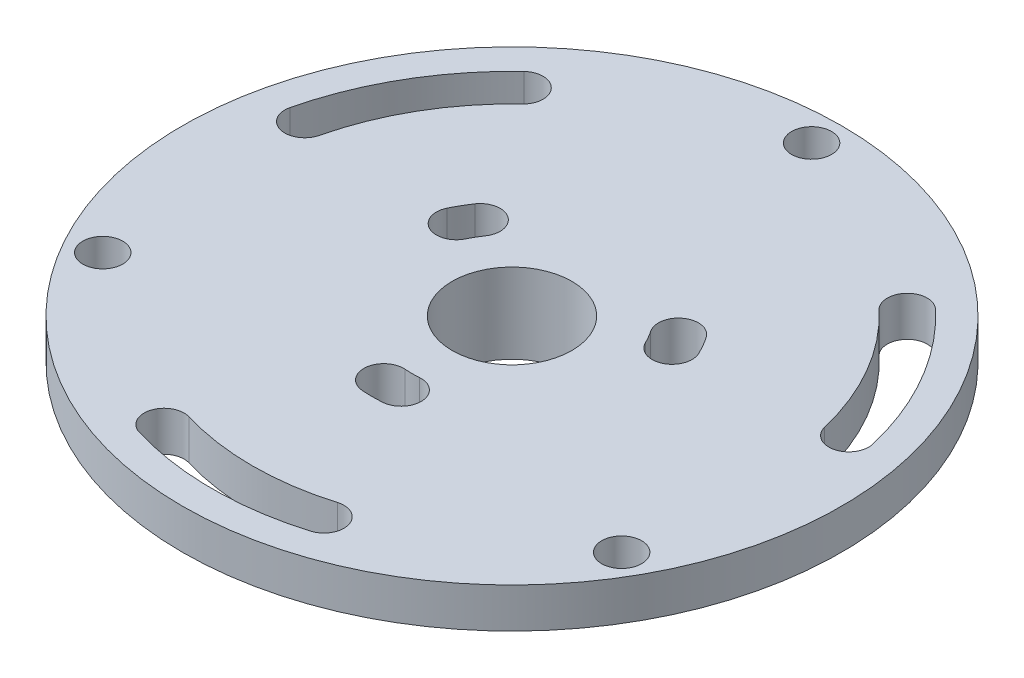
ISO-10303-21;
HEADER;
FILE_DESCRIPTION(('STEP AP214'),'2;1');
FILE_NAME('part.step','',(''),(''),'','','');
FILE_SCHEMA(('AUTOMOTIVE_DESIGN { 1 0 10303 214 1 1 1 1 }'));
ENDSEC;
DATA;
#1=APPLICATION_CONTEXT('core data for automotive mechanical design processes');
#2=APPLICATION_PROTOCOL_DEFINITION('international standard','automotive_design',2000,#1);
#3=PRODUCT_CONTEXT('',#1,'mechanical');
#4=PRODUCT('Part','Part','',(#3));
#5=PRODUCT_RELATED_PRODUCT_CATEGORY('part','',(#4));
#6=PRODUCT_DEFINITION_FORMATION('','',#4);
#7=PRODUCT_DEFINITION_CONTEXT('part definition',#1,'design');
#8=PRODUCT_DEFINITION('design','',#6,#7);
#9=PRODUCT_DEFINITION_SHAPE('','',#8);
#10=(LENGTH_UNIT() NAMED_UNIT(*) SI_UNIT(.MILLI.,.METRE.));
#11=(NAMED_UNIT(*) PLANE_ANGLE_UNIT() SI_UNIT($,.RADIAN.));
#12=(NAMED_UNIT(*) SI_UNIT($,.STERADIAN.) SOLID_ANGLE_UNIT());
#13=UNCERTAINTY_MEASURE_WITH_UNIT(LENGTH_MEASURE(1.E-05),#10,'distance_accuracy_value','');
#14=(GEOMETRIC_REPRESENTATION_CONTEXT(3) GLOBAL_UNCERTAINTY_ASSIGNED_CONTEXT((#13)) GLOBAL_UNIT_ASSIGNED_CONTEXT((#10,
#11,#12)) REPRESENTATION_CONTEXT('',''));
#15=CARTESIAN_POINT('',(0.,0.,0.));
#16=DIRECTION('',(0.,0.,1.));
#17=DIRECTION('',(1.,0.,0.));
#18=AXIS2_PLACEMENT_3D('',#15,#16,#17);
#19=CARTESIAN_POINT('',(0.,0.,0.));
#20=DIRECTION('',(0.,1.,0.));
#21=DIRECTION('',(0.,0.,1.));
#22=AXIS2_PLACEMENT_3D('',#19,#20,#21);
#23=PLANE('',#22);
#24=CARTESIAN_POINT('',(0.,0.,0.));
#25=DIRECTION('',(0.,-1.,0.));
#26=DIRECTION('',(0.,0.,1.));
#27=AXIS2_PLACEMENT_3D('',#24,#25,#26);
#28=CIRCLE('',#27,5.);
#29=CARTESIAN_POINT('',(-4.49987010334877,0.,-2.17971765441948));
#30=VERTEX_POINT('',#29);
#31=CARTESIAN_POINT('',(-4.13762591347903,0.,-2.80714299602047));
#32=VERTEX_POINT('',#31);
#33=EDGE_CURVE('E277',#30,#32,#28,.T.);
#34=ORIENTED_EDGE('',*,*,#33,.T.);
#35=CARTESIAN_POINT('',(-4.96515109617484,0.,-3.36857159522456));
#36=DIRECTION('',(0.,1.,0.));
#37=DIRECTION('',(0.,0.,1.));
#38=AXIS2_PLACEMENT_3D('',#35,#36,#37);
#39=CIRCLE('',#38,1.);
#40=CARTESIAN_POINT('',(-5.79267627887065,0.,-3.93000019442866));
#41=VERTEX_POINT('',#40);
#42=EDGE_CURVE('E269',#32,#41,#39,.T.);
#43=ORIENTED_EDGE('',*,*,#42,.T.);
#44=CARTESIAN_POINT('',(0.,0.,0.));
#45=DIRECTION('',(0.,1.,0.));
#46=DIRECTION('',(0.,0.,1.));
#47=AXIS2_PLACEMENT_3D('',#44,#45,#46);
#48=CIRCLE('',#47,7.);
#49=CARTESIAN_POINT('',(-6.29981814468828,0.,-3.05160471618727));
#50=VERTEX_POINT('',#49);
#51=EDGE_CURVE('E272',#41,#50,#48,.T.);
#52=ORIENTED_EDGE('',*,*,#51,.T.);
#53=CARTESIAN_POINT('',(-5.39984412401852,0.,-2.61566118530337));
#54=DIRECTION('',(0.,1.,0.));
#55=DIRECTION('',(0.,0.,1.));
#56=AXIS2_PLACEMENT_3D('',#53,#54,#55);
#57=CIRCLE('',#56,0.999999999999999);
#58=EDGE_CURVE('E49',#50,#30,#57,.T.);
#59=ORIENTED_EDGE('',*,*,#58,.T.);
#60=EDGE_LOOP('',(#34,#43,#52,#59));
#61=FACE_BOUND('',#60,.T.);
#62=CARTESIAN_POINT('',(0.,0.,0.));
#63=DIRECTION('',(0.,-1.,0.));
#64=DIRECTION('',(0.,0.,1.));
#65=AXIS2_PLACEMENT_3D('',#62,#63,#64);
#66=CIRCLE('',#65,13.);
#67=CARTESIAN_POINT('',(-12.6462331418066,0.,-3.01210679144539));
#68=VERTEX_POINT('',#67);
#69=CARTESIAN_POINT('',(-8.93167757120652,0.,-9.44590576726269));
#70=VERTEX_POINT('',#69);
#71=EDGE_CURVE('E247',#68,#70,#66,.T.);
#72=ORIENTED_EDGE('',*,*,#71,.T.);
#73=CARTESIAN_POINT('',(-9.61872969206856,0.,-10.172513903206));
#74=DIRECTION('',(0.,1.,0.));
#75=DIRECTION('',(0.,0.,1.));
#76=AXIS2_PLACEMENT_3D('',#73,#74,#75);
#77=CIRCLE('',#76,1.);
#78=CARTESIAN_POINT('',(-10.3057818129306,0.,-10.8991220391493));
#79=VERTEX_POINT('',#78);
#80=EDGE_CURVE('E239',#70,#79,#77,.T.);
#81=ORIENTED_EDGE('',*,*,#80,.T.);
#82=CARTESIAN_POINT('',(0.,0.,0.));
#83=DIRECTION('',(0.,1.,0.));
#84=DIRECTION('',(0.,0.,1.));
#85=AXIS2_PLACEMENT_3D('',#82,#83,#84);
#86=CIRCLE('',#85,15.);
#87=CARTESIAN_POINT('',(-14.5918074713154,0.,-3.47550783628315));
#88=VERTEX_POINT('',#87);
#89=EDGE_CURVE('E242',#79,#88,#86,.T.);
#90=ORIENTED_EDGE('',*,*,#89,.T.);
#91=CARTESIAN_POINT('',(-13.619020306561,0.,-3.24380731386427));
#92=DIRECTION('',(0.,1.,0.));
#93=DIRECTION('',(0.,0.,1.));
#94=AXIS2_PLACEMENT_3D('',#91,#92,#93);
#95=CIRCLE('',#94,1.);
#96=EDGE_CURVE('E57',#88,#68,#95,.T.);
#97=ORIENTED_EDGE('',*,*,#96,.T.);
#98=EDGE_LOOP('',(#72,#81,#90,#97));
#99=FACE_BOUND('',#98,.T.);
#100=CARTESIAN_POINT('',(0.,0.,0.));
#101=DIRECTION('',(0.,-1.,0.));
#102=DIRECTION('',(0.,0.,1.));
#103=AXIS2_PLACEMENT_3D('',#100,#101,#102);
#104=CIRCLE('',#103,5.);
#105=CARTESIAN_POINT('',(0.362244189869713,0.,4.98686065043988));
#106=VERTEX_POINT('',#105);
#107=CARTESIAN_POINT('',(-0.362244189869749,0.,4.98686065043988));
#108=VERTEX_POINT('',#107);
#109=EDGE_CURVE('E207',#106,#108,#104,.T.);
#110=ORIENTED_EDGE('',*,*,#109,.T.);
#111=CARTESIAN_POINT('',(-0.434693027843695,0.,5.98423278052785));
#112=DIRECTION('',(0.,1.,0.));
#113=DIRECTION('',(0.,0.,1.));
#114=AXIS2_PLACEMENT_3D('',#111,#112,#113);
#115=CIRCLE('',#114,1.);
#116=CARTESIAN_POINT('',(-0.507141865817648,0.,6.98160491061583));
#117=VERTEX_POINT('',#116);
#118=EDGE_CURVE('E199',#108,#117,#115,.T.);
#119=ORIENTED_EDGE('',*,*,#118,.T.);
#120=CARTESIAN_POINT('',(0.,0.,0.));
#121=DIRECTION('',(0.,1.,0.));
#122=DIRECTION('',(0.,0.,1.));
#123=AXIS2_PLACEMENT_3D('',#120,#121,#122);
#124=CIRCLE('',#123,7.);
#125=CARTESIAN_POINT('',(0.507141865817597,0.,6.98160491061583));
#126=VERTEX_POINT('',#125);
#127=EDGE_CURVE('E211',#117,#126,#124,.T.);
#128=ORIENTED_EDGE('',*,*,#127,.T.);
#129=CARTESIAN_POINT('',(0.434693027843655,0.,5.98423278052786));
#130=DIRECTION('',(0.,1.,0.));
#131=DIRECTION('',(0.,0.,1.));
#132=AXIS2_PLACEMENT_3D('',#129,#130,#131);
#133=CIRCLE('',#132,0.999999999999999);
#134=EDGE_CURVE('E215',#126,#106,#133,.T.);
#135=ORIENTED_EDGE('',*,*,#134,.T.);
#136=EDGE_LOOP('',(#110,#119,#128,#135));
#137=FACE_BOUND('',#136,.T.);
#138=CARTESIAN_POINT('',(0.,0.,0.));
#139=DIRECTION('',(0.,-1.,0.));
#140=DIRECTION('',(0.,0.,1.));
#141=AXIS2_PLACEMENT_3D('',#138,#139,#140);
#142=CIRCLE('',#141,13.);
#143=CARTESIAN_POINT('',(3.71455557060004,0.,12.4580125587079));
#144=VERTEX_POINT('',#143);
#145=CARTESIAN_POINT('',(-3.71455557060012,0.,12.4580125587079));
#146=VERTEX_POINT('',#145);
#147=EDGE_CURVE('E342',#144,#146,#142,.T.);
#148=ORIENTED_EDGE('',*,*,#147,.T.);
#149=CARTESIAN_POINT('',(-4.00029061449243,0.,13.41632121707));
#150=DIRECTION('',(0.,1.,0.));
#151=DIRECTION('',(0.,0.,1.));
#152=AXIS2_PLACEMENT_3D('',#149,#150,#151);
#153=CIRCLE('',#152,1.);
#154=CARTESIAN_POINT('',(-4.28602565838475,0.,14.3746298754322));
#155=VERTEX_POINT('',#154);
#156=EDGE_CURVE('E332',#146,#155,#153,.T.);
#157=ORIENTED_EDGE('',*,*,#156,.T.);
#158=CARTESIAN_POINT('',(0.,0.,0.));
#159=DIRECTION('',(0.,1.,0.));
#160=DIRECTION('',(0.,0.,1.));
#161=AXIS2_PLACEMENT_3D('',#158,#159,#160);
#162=CIRCLE('',#161,15.);
#163=CARTESIAN_POINT('',(4.28602565838466,0.,14.3746298754322));
#164=VERTEX_POINT('',#163);
#165=EDGE_CURVE('E335',#155,#164,#162,.T.);
#166=ORIENTED_EDGE('',*,*,#165,.T.);
#167=CARTESIAN_POINT('',(4.00029061449235,0.,13.4163212170701));
#168=DIRECTION('',(0.,1.,0.));
#169=DIRECTION('',(0.,0.,1.));
#170=AXIS2_PLACEMENT_3D('',#167,#168,#169);
#171=CIRCLE('',#170,1.);
#172=EDGE_CURVE('E339',#164,#144,#171,.T.);
#173=ORIENTED_EDGE('',*,*,#172,.T.);
#174=EDGE_LOOP('',(#148,#157,#166,#173));
#175=FACE_BOUND('',#174,.T.);
#176=CARTESIAN_POINT('',(0.,0.,0.));
#177=DIRECTION('',(0.,-1.,0.));
#178=DIRECTION('',(0.,0.,1.));
#179=AXIS2_PLACEMENT_3D('',#176,#177,#178);
#180=CIRCLE('',#179,5.);
#181=CARTESIAN_POINT('',(4.13762591347906,0.,-2.80714299602044));
#182=VERTEX_POINT('',#181);
#183=CARTESIAN_POINT('',(4.49987010334878,0.,-2.17971765441945));
#184=VERTEX_POINT('',#183);
#185=EDGE_CURVE('E308',#182,#184,#180,.T.);
#186=ORIENTED_EDGE('',*,*,#185,.T.);
#187=CARTESIAN_POINT('',(5.39984412401854,0.,-2.61566118530334));
#188=DIRECTION('',(0.,1.,0.));
#189=DIRECTION('',(0.,0.,1.));
#190=AXIS2_PLACEMENT_3D('',#187,#188,#189);
#191=CIRCLE('',#190,1.);
#192=CARTESIAN_POINT('',(6.2998181446883,0.,-3.05160471618722));
#193=VERTEX_POINT('',#192);
#194=EDGE_CURVE('E298',#184,#193,#191,.T.);
#195=ORIENTED_EDGE('',*,*,#194,.T.);
#196=CARTESIAN_POINT('',(0.,0.,0.));
#197=DIRECTION('',(0.,1.,0.));
#198=DIRECTION('',(0.,0.,1.));
#199=AXIS2_PLACEMENT_3D('',#196,#197,#198);
#200=CIRCLE('',#199,7.);
#201=CARTESIAN_POINT('',(5.79267627887068,0.,-3.93000019442862));
#202=VERTEX_POINT('',#201);
#203=EDGE_CURVE('E301',#193,#202,#200,.T.);
#204=ORIENTED_EDGE('',*,*,#203,.T.);
#205=CARTESIAN_POINT('',(4.96515109617487,0.,-3.36857159522453));
#206=DIRECTION('',(0.,1.,0.));
#207=DIRECTION('',(0.,0.,1.));
#208=AXIS2_PLACEMENT_3D('',#205,#206,#207);
#209=CIRCLE('',#208,0.999999999999999);
#210=EDGE_CURVE('E305',#202,#182,#209,.T.);
#211=ORIENTED_EDGE('',*,*,#210,.T.);
#212=EDGE_LOOP('',(#186,#195,#204,#211));
#213=FACE_BOUND('',#212,.T.);
#214=CARTESIAN_POINT('',(0.,0.,0.));
#215=DIRECTION('',(0.,-1.,0.));
#216=DIRECTION('',(0.,0.,1.));
#217=AXIS2_PLACEMENT_3D('',#214,#215,#216);
#218=CIRCLE('',#217,13.);
#219=CARTESIAN_POINT('',(8.93167757120658,0.,-9.44590576726263));
#220=VERTEX_POINT('',#219);
#221=CARTESIAN_POINT('',(12.6462331418067,0.,-3.01210679144531));
#222=VERTEX_POINT('',#221);
#223=EDGE_CURVE('E372',#220,#222,#218,.T.);
#224=ORIENTED_EDGE('',*,*,#223,.T.);
#225=CARTESIAN_POINT('',(13.619020306561,0.,-3.24380731386418));
#226=DIRECTION('',(0.,1.,0.));
#227=DIRECTION('',(0.,0.,1.));
#228=AXIS2_PLACEMENT_3D('',#225,#226,#227);
#229=CIRCLE('',#228,1.);
#230=CARTESIAN_POINT('',(14.5918074713154,0.,-3.47550783628305));
#231=VERTEX_POINT('',#230);
#232=EDGE_CURVE('E362',#222,#231,#229,.T.);
#233=ORIENTED_EDGE('',*,*,#232,.T.);
#234=CARTESIAN_POINT('',(0.,0.,0.));
#235=DIRECTION('',(0.,1.,0.));
#236=DIRECTION('',(0.,0.,1.));
#237=AXIS2_PLACEMENT_3D('',#234,#235,#236);
#238=CIRCLE('',#237,15.);
#239=CARTESIAN_POINT('',(10.3057818129307,0.,-10.8991220391492));
#240=VERTEX_POINT('',#239);
#241=EDGE_CURVE('E365',#231,#240,#238,.T.);
#242=ORIENTED_EDGE('',*,*,#241,.T.);
#243=CARTESIAN_POINT('',(9.61872969206862,0.,-10.1725139032059));
#244=DIRECTION('',(0.,1.,0.));
#245=DIRECTION('',(0.,0.,1.));
#246=AXIS2_PLACEMENT_3D('',#243,#244,#245);
#247=CIRCLE('',#246,1.);
#248=EDGE_CURVE('E369',#240,#220,#247,.T.);
#249=ORIENTED_EDGE('',*,*,#248,.T.);
#250=EDGE_LOOP('',(#224,#233,#242,#249));
#251=FACE_BOUND('',#250,.T.);
#252=CARTESIAN_POINT('',(-12.9903810567656,0.,7.50000000000056));
#253=DIRECTION('',(0.,1.,0.));
#254=DIRECTION('',(0.,0.,1.));
#255=AXIS2_PLACEMENT_3D('',#252,#253,#254);
#256=CIRCLE('',#255,1.00000000000122);
#257=CARTESIAN_POINT('',(-12.9903810567656,0.,8.50000000000178));
#258=VERTEX_POINT('',#257);
#259=EDGE_CURVE('E399',#258,#258,#256,.T.);
#260=ORIENTED_EDGE('',*,*,#259,.T.);
#261=EDGE_LOOP('',(#260));
#262=FACE_BOUND('',#261,.T.);
#263=CARTESIAN_POINT('',(12.9903810567675,0.,7.49999999999944));
#264=DIRECTION('',(0.,1.,0.));
#265=DIRECTION('',(0.,0.,1.));
#266=AXIS2_PLACEMENT_3D('',#263,#264,#265);
#267=CIRCLE('',#266,1.00000000000082);
#268=CARTESIAN_POINT('',(12.9903810567675,0.,8.50000000000027));
#269=VERTEX_POINT('',#268);
#270=EDGE_CURVE('E403',#269,#269,#267,.T.);
#271=ORIENTED_EDGE('',*,*,#270,.T.);
#272=EDGE_LOOP('',(#271));
#273=FACE_BOUND('',#272,.T.);
#274=CARTESIAN_POINT('',(0.,0.,-15.));
#275=DIRECTION('',(0.,1.,0.));
#276=DIRECTION('',(0.,0.,1.));
#277=AXIS2_PLACEMENT_3D('',#274,#275,#276);
#278=CIRCLE('',#277,1.);
#279=CARTESIAN_POINT('',(0.,0.,-14.));
#280=VERTEX_POINT('',#279);
#281=EDGE_CURVE('E414',#280,#280,#278,.T.);
#282=ORIENTED_EDGE('',*,*,#281,.T.);
#283=EDGE_LOOP('',(#282));
#284=FACE_BOUND('',#283,.T.);
#285=CARTESIAN_POINT('',(0.,0.,0.));
#286=DIRECTION('',(0.,1.,0.));
#287=DIRECTION('',(0.,0.,1.));
#288=AXIS2_PLACEMENT_3D('',#285,#286,#287);
#289=CIRCLE('',#288,16.5);
#290=CARTESIAN_POINT('',(0.,0.,16.5));
#291=VERTEX_POINT('',#290);
#292=EDGE_CURVE('E418',#291,#291,#289,.T.);
#293=ORIENTED_EDGE('',*,*,#292,.F.);
#294=EDGE_LOOP('',(#293));
#295=FACE_BOUND('',#294,.T.);
#296=CARTESIAN_POINT('',(0.,0.,0.));
#297=DIRECTION('',(0.,1.,0.));
#298=DIRECTION('',(0.,0.,1.));
#299=AXIS2_PLACEMENT_3D('',#296,#297,#298);
#300=CIRCLE('',#299,4.);
#301=CARTESIAN_POINT('',(0.,0.,4.));
#302=VERTEX_POINT('',#301);
#303=EDGE_CURVE('E11',#302,#302,#300,.F.);
#304=ORIENTED_EDGE('',*,*,#303,.F.);
#305=EDGE_LOOP('',(#304));
#306=FACE_BOUND('',#305,.T.);
#307=ADVANCED_FACE('F34',(#61,#99,#137,#175,#213,#251,#262,#273,#284,#295,#306),#23,.F.);
#308=CARTESIAN_POINT('',(0.,2.,0.));
#309=DIRECTION('',(0.,1.,0.));
#310=DIRECTION('',(0.,0.,1.));
#311=AXIS2_PLACEMENT_3D('',#308,#309,#310);
#312=PLANE('',#311);
#313=CARTESIAN_POINT('',(-4.96515109617484,2.,-3.36857159522456));
#314=DIRECTION('',(0.,1.,0.));
#315=DIRECTION('',(0.,0.,1.));
#316=AXIS2_PLACEMENT_3D('',#313,#314,#315);
#317=CIRCLE('',#316,1.);
#318=CARTESIAN_POINT('',(-4.13762591347903,2.,-2.80714299602047));
#319=VERTEX_POINT('',#318);
#320=CARTESIAN_POINT('',(-5.79267627887065,2.,-3.93000019442866));
#321=VERTEX_POINT('',#320);
#322=EDGE_CURVE('E281',#319,#321,#317,.T.);
#323=ORIENTED_EDGE('',*,*,#322,.F.);
#324=CARTESIAN_POINT('',(0.,2.,0.));
#325=DIRECTION('',(0.,-1.,0.));
#326=DIRECTION('',(0.,0.,1.));
#327=AXIS2_PLACEMENT_3D('',#324,#325,#326);
#328=CIRCLE('',#327,5.);
#329=CARTESIAN_POINT('',(-4.49987010334877,2.,-2.17971765441948));
#330=VERTEX_POINT('',#329);
#331=EDGE_CURVE('E273',#330,#319,#328,.T.);
#332=ORIENTED_EDGE('',*,*,#331,.F.);
#333=CARTESIAN_POINT('',(-5.39984412401852,2.,-2.61566118530337));
#334=DIRECTION('',(0.,1.,0.));
#335=DIRECTION('',(0.,0.,1.));
#336=AXIS2_PLACEMENT_3D('',#333,#334,#335);
#337=CIRCLE('',#336,0.999999999999999);
#338=CARTESIAN_POINT('',(-6.29981814468828,2.,-3.05160471618727));
#339=VERTEX_POINT('',#338);
#340=EDGE_CURVE('E286',#339,#330,#337,.T.);
#341=ORIENTED_EDGE('',*,*,#340,.F.);
#342=CARTESIAN_POINT('',(0.,2.,0.));
#343=DIRECTION('',(0.,1.,0.));
#344=DIRECTION('',(0.,0.,1.));
#345=AXIS2_PLACEMENT_3D('',#342,#343,#344);
#346=CIRCLE('',#345,7.);
#347=EDGE_CURVE('E283',#321,#339,#346,.T.);
#348=ORIENTED_EDGE('',*,*,#347,.F.);
#349=EDGE_LOOP('',(#323,#332,#341,#348));
#350=FACE_BOUND('',#349,.T.);
#351=CARTESIAN_POINT('',(-9.61872969206856,2.,-10.172513903206));
#352=DIRECTION('',(0.,1.,0.));
#353=DIRECTION('',(0.,0.,1.));
#354=AXIS2_PLACEMENT_3D('',#351,#352,#353);
#355=CIRCLE('',#354,1.);
#356=CARTESIAN_POINT('',(-8.93167757120652,2.,-9.44590576726269));
#357=VERTEX_POINT('',#356);
#358=CARTESIAN_POINT('',(-10.3057818129306,2.,-10.8991220391493));
#359=VERTEX_POINT('',#358);
#360=EDGE_CURVE('E251',#357,#359,#355,.T.);
#361=ORIENTED_EDGE('',*,*,#360,.F.);
#362=CARTESIAN_POINT('',(0.,2.,0.));
#363=DIRECTION('',(0.,-1.,0.));
#364=DIRECTION('',(0.,0.,1.));
#365=AXIS2_PLACEMENT_3D('',#362,#363,#364);
#366=CIRCLE('',#365,13.);
#367=CARTESIAN_POINT('',(-12.6462331418066,2.,-3.01210679144539));
#368=VERTEX_POINT('',#367);
#369=EDGE_CURVE('E243',#368,#357,#366,.T.);
#370=ORIENTED_EDGE('',*,*,#369,.F.);
#371=CARTESIAN_POINT('',(-13.619020306561,2.,-3.24380731386427));
#372=DIRECTION('',(0.,1.,0.));
#373=DIRECTION('',(0.,0.,1.));
#374=AXIS2_PLACEMENT_3D('',#371,#372,#373);
#375=CIRCLE('',#374,1.);
#376=CARTESIAN_POINT('',(-14.5918074713154,2.,-3.47550783628315));
#377=VERTEX_POINT('',#376);
#378=EDGE_CURVE('E257',#377,#368,#375,.T.);
#379=ORIENTED_EDGE('',*,*,#378,.F.);
#380=CARTESIAN_POINT('',(0.,2.,0.));
#381=DIRECTION('',(0.,1.,0.));
#382=DIRECTION('',(0.,0.,1.));
#383=AXIS2_PLACEMENT_3D('',#380,#381,#382);
#384=CIRCLE('',#383,15.);
#385=EDGE_CURVE('E253',#359,#377,#384,.T.);
#386=ORIENTED_EDGE('',*,*,#385,.F.);
#387=EDGE_LOOP('',(#361,#370,#379,#386));
#388=FACE_BOUND('',#387,.T.);
#389=CARTESIAN_POINT('',(-0.434693027843695,2.,5.98423278052785));
#390=DIRECTION('',(0.,1.,0.));
#391=DIRECTION('',(0.,0.,1.));
#392=AXIS2_PLACEMENT_3D('',#389,#390,#391);
#393=CIRCLE('',#392,1.);
#394=CARTESIAN_POINT('',(-0.362244189869749,2.,4.98686065043988));
#395=VERTEX_POINT('',#394);
#396=CARTESIAN_POINT('',(-0.507141865817648,2.,6.98160491061583));
#397=VERTEX_POINT('',#396);
#398=EDGE_CURVE('E202',#395,#397,#393,.T.);
#399=ORIENTED_EDGE('',*,*,#398,.F.);
#400=CARTESIAN_POINT('',(0.,2.,0.));
#401=DIRECTION('',(0.,-1.,0.));
#402=DIRECTION('',(0.,0.,1.));
#403=AXIS2_PLACEMENT_3D('',#400,#401,#402);
#404=CIRCLE('',#403,5.);
#405=CARTESIAN_POINT('',(0.362244189869713,2.,4.98686065043988));
#406=VERTEX_POINT('',#405);
#407=EDGE_CURVE('E219',#406,#395,#404,.T.);
#408=ORIENTED_EDGE('',*,*,#407,.F.);
#409=CARTESIAN_POINT('',(0.434693027843655,2.,5.98423278052786));
#410=DIRECTION('',(0.,1.,0.));
#411=DIRECTION('',(0.,0.,1.));
#412=AXIS2_PLACEMENT_3D('',#409,#410,#411);
#413=CIRCLE('',#412,0.999999999999999);
#414=CARTESIAN_POINT('',(0.507141865817597,2.,6.98160491061583));
#415=VERTEX_POINT('',#414);
#416=EDGE_CURVE('E222',#415,#406,#413,.T.);
#417=ORIENTED_EDGE('',*,*,#416,.F.);
#418=CARTESIAN_POINT('',(0.,2.,0.));
#419=DIRECTION('',(0.,1.,0.));
#420=DIRECTION('',(0.,0.,1.));
#421=AXIS2_PLACEMENT_3D('',#418,#419,#420);
#422=CIRCLE('',#421,7.);
#423=EDGE_CURVE('E228',#397,#415,#422,.T.);
#424=ORIENTED_EDGE('',*,*,#423,.F.);
#425=EDGE_LOOP('',(#399,#408,#417,#424));
#426=FACE_BOUND('',#425,.T.);
#427=CARTESIAN_POINT('',(-4.00029061449243,2.,13.41632121707));
#428=DIRECTION('',(0.,1.,0.));
#429=DIRECTION('',(0.,0.,1.));
#430=AXIS2_PLACEMENT_3D('',#427,#428,#429);
#431=CIRCLE('',#430,1.);
#432=CARTESIAN_POINT('',(-3.71455557060012,2.,12.4580125587079));
#433=VERTEX_POINT('',#432);
#434=CARTESIAN_POINT('',(-4.28602565838475,2.,14.3746298754322));
#435=VERTEX_POINT('',#434);
#436=EDGE_CURVE('E235',#433,#435,#431,.T.);
#437=ORIENTED_EDGE('',*,*,#436,.F.);
#438=CARTESIAN_POINT('',(0.,2.,0.));
#439=DIRECTION('',(0.,-1.,0.));
#440=DIRECTION('',(0.,0.,1.));
#441=AXIS2_PLACEMENT_3D('',#438,#439,#440);
#442=CIRCLE('',#441,13.);
#443=CARTESIAN_POINT('',(3.71455557060004,2.,12.4580125587079));
#444=VERTEX_POINT('',#443);
#445=EDGE_CURVE('E336',#444,#433,#442,.T.);
#446=ORIENTED_EDGE('',*,*,#445,.F.);
#447=CARTESIAN_POINT('',(4.00029061449235,2.,13.4163212170701));
#448=DIRECTION('',(0.,1.,0.));
#449=DIRECTION('',(0.,0.,1.));
#450=AXIS2_PLACEMENT_3D('',#447,#448,#449);
#451=CIRCLE('',#450,1.);
#452=CARTESIAN_POINT('',(4.28602565838466,2.,14.3746298754322));
#453=VERTEX_POINT('',#452);
#454=EDGE_CURVE('E350',#453,#444,#451,.T.);
#455=ORIENTED_EDGE('',*,*,#454,.F.);
#456=CARTESIAN_POINT('',(0.,2.,0.));
#457=DIRECTION('',(0.,1.,0.));
#458=DIRECTION('',(0.,0.,1.));
#459=AXIS2_PLACEMENT_3D('',#456,#457,#458);
#460=CIRCLE('',#459,15.);
#461=EDGE_CURVE('E347',#435,#453,#460,.T.);
#462=ORIENTED_EDGE('',*,*,#461,.F.);
#463=EDGE_LOOP('',(#437,#446,#455,#462));
#464=FACE_BOUND('',#463,.T.);
#465=CARTESIAN_POINT('',(5.39984412401854,2.,-2.61566118530334));
#466=DIRECTION('',(0.,1.,0.));
#467=DIRECTION('',(0.,0.,1.));
#468=AXIS2_PLACEMENT_3D('',#465,#466,#467);
#469=CIRCLE('',#468,1.);
#470=CARTESIAN_POINT('',(4.49987010334878,2.,-2.17971765441945));
#471=VERTEX_POINT('',#470);
#472=CARTESIAN_POINT('',(6.2998181446883,2.,-3.05160471618722));
#473=VERTEX_POINT('',#472);
#474=EDGE_CURVE('E312',#471,#473,#469,.T.);
#475=ORIENTED_EDGE('',*,*,#474,.F.);
#476=CARTESIAN_POINT('',(0.,2.,0.));
#477=DIRECTION('',(0.,-1.,0.));
#478=DIRECTION('',(0.,0.,1.));
#479=AXIS2_PLACEMENT_3D('',#476,#477,#478);
#480=CIRCLE('',#479,5.);
#481=CARTESIAN_POINT('',(4.13762591347906,2.,-2.80714299602044));
#482=VERTEX_POINT('',#481);
#483=EDGE_CURVE('E302',#482,#471,#480,.T.);
#484=ORIENTED_EDGE('',*,*,#483,.F.);
#485=CARTESIAN_POINT('',(4.96515109617487,2.,-3.36857159522453));
#486=DIRECTION('',(0.,1.,0.));
#487=DIRECTION('',(0.,0.,1.));
#488=AXIS2_PLACEMENT_3D('',#485,#486,#487);
#489=CIRCLE('',#488,0.999999999999999);
#490=CARTESIAN_POINT('',(5.79267627887068,2.,-3.93000019442862));
#491=VERTEX_POINT('',#490);
#492=EDGE_CURVE('E318',#491,#482,#489,.T.);
#493=ORIENTED_EDGE('',*,*,#492,.F.);
#494=CARTESIAN_POINT('',(0.,2.,0.));
#495=DIRECTION('',(0.,1.,0.));
#496=DIRECTION('',(0.,0.,1.));
#497=AXIS2_PLACEMENT_3D('',#494,#495,#496);
#498=CIRCLE('',#497,7.);
#499=EDGE_CURVE('E314',#473,#491,#498,.T.);
#500=ORIENTED_EDGE('',*,*,#499,.F.);
#501=EDGE_LOOP('',(#475,#484,#493,#500));
#502=FACE_BOUND('',#501,.T.);
#503=CARTESIAN_POINT('',(13.619020306561,2.,-3.24380731386418));
#504=DIRECTION('',(0.,1.,0.));
#505=DIRECTION('',(0.,0.,1.));
#506=AXIS2_PLACEMENT_3D('',#503,#504,#505);
#507=CIRCLE('',#506,1.);
#508=CARTESIAN_POINT('',(12.6462331418067,2.,-3.01210679144531));
#509=VERTEX_POINT('',#508);
#510=CARTESIAN_POINT('',(14.5918074713154,2.,-3.47550783628305));
#511=VERTEX_POINT('',#510);
#512=EDGE_CURVE('E325',#509,#511,#507,.T.);
#513=ORIENTED_EDGE('',*,*,#512,.F.);
#514=CARTESIAN_POINT('',(0.,2.,0.));
#515=DIRECTION('',(0.,-1.,0.));
#516=DIRECTION('',(0.,0.,1.));
#517=AXIS2_PLACEMENT_3D('',#514,#515,#516);
#518=CIRCLE('',#517,13.);
#519=CARTESIAN_POINT('',(8.93167757120658,2.,-9.44590576726263));
#520=VERTEX_POINT('',#519);
#521=EDGE_CURVE('E366',#520,#509,#518,.T.);
#522=ORIENTED_EDGE('',*,*,#521,.F.);
#523=CARTESIAN_POINT('',(9.61872969206862,2.,-10.1725139032059));
#524=DIRECTION('',(0.,1.,0.));
#525=DIRECTION('',(0.,0.,1.));
#526=AXIS2_PLACEMENT_3D('',#523,#524,#525);
#527=CIRCLE('',#526,1.);
#528=CARTESIAN_POINT('',(10.3057818129307,2.,-10.8991220391492));
#529=VERTEX_POINT('',#528);
#530=EDGE_CURVE('E380',#529,#520,#527,.T.);
#531=ORIENTED_EDGE('',*,*,#530,.F.);
#532=CARTESIAN_POINT('',(0.,2.,0.));
#533=DIRECTION('',(0.,1.,0.));
#534=DIRECTION('',(0.,0.,1.));
#535=AXIS2_PLACEMENT_3D('',#532,#533,#534);
#536=CIRCLE('',#535,15.);
#537=EDGE_CURVE('E377',#511,#529,#536,.T.);
#538=ORIENTED_EDGE('',*,*,#537,.F.);
#539=EDGE_LOOP('',(#513,#522,#531,#538));
#540=FACE_BOUND('',#539,.T.);
#541=CARTESIAN_POINT('',(12.9903810567675,2.,7.49999999999944));
#542=DIRECTION('',(0.,1.,0.));
#543=DIRECTION('',(0.,0.,1.));
#544=AXIS2_PLACEMENT_3D('',#541,#542,#543);
#545=CIRCLE('',#544,1.00000000000082);
#546=CARTESIAN_POINT('',(12.9903810567675,2.,8.50000000000027));
#547=VERTEX_POINT('',#546);
#548=EDGE_CURVE('E406',#547,#547,#545,.T.);
#549=ORIENTED_EDGE('',*,*,#548,.F.);
#550=EDGE_LOOP('',(#549));
#551=FACE_BOUND('',#550,.T.);
#552=CARTESIAN_POINT('',(0.,2.,-15.));
#553=DIRECTION('',(0.,1.,0.));
#554=DIRECTION('',(0.,0.,1.));
#555=AXIS2_PLACEMENT_3D('',#552,#553,#554);
#556=CIRCLE('',#555,1.);
#557=CARTESIAN_POINT('',(0.,2.,-14.));
#558=VERTEX_POINT('',#557);
#559=EDGE_CURVE('E415',#558,#558,#556,.T.);
#560=ORIENTED_EDGE('',*,*,#559,.F.);
#561=EDGE_LOOP('',(#560));
#562=FACE_BOUND('',#561,.T.);
#563=CARTESIAN_POINT('',(0.,2.,0.));
#564=DIRECTION('',(0.,1.,0.));
#565=DIRECTION('',(0.,0.,1.));
#566=AXIS2_PLACEMENT_3D('',#563,#564,#565);
#567=CIRCLE('',#566,16.5);
#568=CARTESIAN_POINT('',(0.,2.,16.5));
#569=VERTEX_POINT('',#568);
#570=EDGE_CURVE('E42',#569,#569,#567,.T.);
#571=ORIENTED_EDGE('',*,*,#570,.T.);
#572=EDGE_LOOP('',(#571));
#573=FACE_BOUND('',#572,.T.);
#574=CARTESIAN_POINT('',(0.,2.,0.));
#575=DIRECTION('',(0.,1.,0.));
#576=DIRECTION('',(0.,0.,1.));
#577=AXIS2_PLACEMENT_3D('',#574,#575,#576);
#578=CIRCLE('',#577,3.);
#579=CARTESIAN_POINT('',(0.,2.,3.));
#580=VERTEX_POINT('',#579);
#581=EDGE_CURVE('E409',#580,#580,#578,.T.);
#582=ORIENTED_EDGE('',*,*,#581,.F.);
#583=EDGE_LOOP('',(#582));
#584=FACE_BOUND('',#583,.T.);
#585=CARTESIAN_POINT('',(-12.9903810567656,2.,7.50000000000056));
#586=DIRECTION('',(0.,1.,0.));
#587=DIRECTION('',(0.,0.,1.));
#588=AXIS2_PLACEMENT_3D('',#585,#586,#587);
#589=CIRCLE('',#588,1.00000000000122);
#590=CARTESIAN_POINT('',(-12.9903810567656,2.,8.50000000000178));
#591=VERTEX_POINT('',#590);
#592=EDGE_CURVE('E400',#591,#591,#589,.T.);
#593=ORIENTED_EDGE('',*,*,#592,.F.);
#594=EDGE_LOOP('',(#593));
#595=FACE_BOUND('',#594,.T.);
#596=ADVANCED_FACE('F428',(#350,#388,#426,#464,#502,#540,#551,#562,#573,#584,#595),#312,.T.);
#597=CARTESIAN_POINT('',(0.,2.,0.));
#598=DIRECTION('',(0.,-1.,0.));
#599=DIRECTION('',(0.,0.,-1.));
#600=AXIS2_PLACEMENT_3D('',#597,#598,#599);
#601=CYLINDRICAL_SURFACE('',#600,16.5);
#602=ORIENTED_EDGE('',*,*,#570,.F.);
#603=EDGE_LOOP('',(#602));
#604=FACE_BOUND('',#603,.T.);
#605=ORIENTED_EDGE('',*,*,#292,.T.);
#606=EDGE_LOOP('',(#605));
#607=FACE_BOUND('',#606,.T.);
#608=ADVANCED_FACE('F36',(#604,#607),#601,.T.);
#609=CARTESIAN_POINT('',(0.,2.,-15.));
#610=DIRECTION('',(0.,-1.,0.));
#611=DIRECTION('',(0.,0.,-1.));
#612=AXIS2_PLACEMENT_3D('',#609,#610,#611);
#613=CYLINDRICAL_SURFACE('',#612,1.);
#614=ORIENTED_EDGE('',*,*,#559,.T.);
#615=EDGE_LOOP('',(#614));
#616=FACE_BOUND('',#615,.T.);
#617=ORIENTED_EDGE('',*,*,#281,.F.);
#618=EDGE_LOOP('',(#617));
#619=FACE_BOUND('',#618,.T.);
#620=ADVANCED_FACE('F460',(#616,#619),#613,.F.);
#621=CARTESIAN_POINT('',(0.,2.,0.));
#622=DIRECTION('',(0.,-1.,0.));
#623=DIRECTION('',(0.,0.,-1.));
#624=AXIS2_PLACEMENT_3D('',#621,#622,#623);
#625=CYLINDRICAL_SURFACE('',#624,3.);
#626=ORIENTED_EDGE('',*,*,#581,.T.);
#627=EDGE_LOOP('',(#626));
#628=FACE_BOUND('',#627,.T.);
#629=CARTESIAN_POINT('',(0.,-2.,0.));
#630=DIRECTION('',(0.,-1.,0.));
#631=DIRECTION('',(0.,0.,-1.));
#632=AXIS2_PLACEMENT_3D('',#629,#630,#631);
#633=CIRCLE('',#632,3.);
#634=CARTESIAN_POINT('',(0.,-2.,-3.));
#635=VERTEX_POINT('',#634);
#636=EDGE_CURVE('E387',#635,#635,#633,.T.);
#637=ORIENTED_EDGE('',*,*,#636,.T.);
#638=EDGE_LOOP('',(#637));
#639=FACE_BOUND('',#638,.T.);
#640=ADVANCED_FACE('F456',(#628,#639),#625,.F.);
#641=CARTESIAN_POINT('',(12.9903810567675,2.,7.49999999999944));
#642=DIRECTION('',(0.,-1.,0.));
#643=DIRECTION('',(0.,0.,-1.));
#644=AXIS2_PLACEMENT_3D('',#641,#642,#643);
#645=CYLINDRICAL_SURFACE('',#644,1.00000000000082);
#646=ORIENTED_EDGE('',*,*,#548,.T.);
#647=EDGE_LOOP('',(#646));
#648=FACE_BOUND('',#647,.T.);
#649=ORIENTED_EDGE('',*,*,#270,.F.);
#650=EDGE_LOOP('',(#649));
#651=FACE_BOUND('',#650,.T.);
#652=ADVANCED_FACE('F452',(#648,#651),#645,.F.);
#653=CARTESIAN_POINT('',(-12.9903810567656,2.,7.50000000000056));
#654=DIRECTION('',(0.,-1.,0.));
#655=DIRECTION('',(0.,0.,-1.));
#656=AXIS2_PLACEMENT_3D('',#653,#654,#655);
#657=CYLINDRICAL_SURFACE('',#656,1.00000000000122);
#658=ORIENTED_EDGE('',*,*,#592,.T.);
#659=EDGE_LOOP('',(#658));
#660=FACE_BOUND('',#659,.T.);
#661=ORIENTED_EDGE('',*,*,#259,.F.);
#662=EDGE_LOOP('',(#661));
#663=FACE_BOUND('',#662,.T.);
#664=ADVANCED_FACE('F445',(#660,#663),#657,.F.);
#665=CARTESIAN_POINT('',(0.,-2.,0.));
#666=DIRECTION('',(0.,-1.,0.));
#667=DIRECTION('',(0.,0.,-1.));
#668=AXIS2_PLACEMENT_3D('',#665,#666,#667);
#669=PLANE('',#668);
#670=CARTESIAN_POINT('',(0.,-2.,0.));
#671=DIRECTION('',(0.,-1.,0.));
#672=DIRECTION('',(0.,0.,-1.));
#673=AXIS2_PLACEMENT_3D('',#670,#671,#672);
#674=CIRCLE('',#673,4.);
#675=CARTESIAN_POINT('',(0.,-2.,-4.));
#676=VERTEX_POINT('',#675);
#677=EDGE_CURVE('E396',#676,#676,#674,.T.);
#678=ORIENTED_EDGE('',*,*,#677,.T.);
#679=EDGE_LOOP('',(#678));
#680=FACE_BOUND('',#679,.T.);
#681=ORIENTED_EDGE('',*,*,#636,.F.);
#682=EDGE_LOOP('',(#681));
#683=FACE_BOUND('',#682,.T.);
#684=ADVANCED_FACE('F435',(#680,#683),#669,.T.);
#685=CARTESIAN_POINT('',(0.,-2.,0.));
#686=DIRECTION('',(0.,1.,0.));
#687=DIRECTION('',(0.,0.,1.));
#688=AXIS2_PLACEMENT_3D('',#685,#686,#687);
#689=CYLINDRICAL_SURFACE('',#688,4.);
#690=ORIENTED_EDGE('',*,*,#677,.F.);
#691=EDGE_LOOP('',(#690));
#692=FACE_BOUND('',#691,.T.);
#693=ORIENTED_EDGE('',*,*,#303,.T.);
#694=EDGE_LOOP('',(#693));
#695=FACE_BOUND('',#694,.T.);
#696=ADVANCED_FACE('F432',(#692,#695),#689,.T.);
#697=CARTESIAN_POINT('',(13.619020306561,0.,-3.24380731386418));
#698=DIRECTION('',(0.,1.,0.));
#699=DIRECTION('',(0.,0.,1.));
#700=AXIS2_PLACEMENT_3D('',#697,#698,#699);
#701=CYLINDRICAL_SURFACE('',#700,1.);
#702=ORIENTED_EDGE('',*,*,#512,.T.);
#703=DIRECTION('',(0.,1.,0.));
#704=VECTOR('',#703,1.);
#705=CARTESIAN_POINT('',(14.5918074713154,0.,-3.47550783628305));
#706=LINE('',#705,#704);
#707=EDGE_CURVE('E375',#231,#511,#706,.T.);
#708=ORIENTED_EDGE('',*,*,#707,.F.);
#709=ORIENTED_EDGE('',*,*,#232,.F.);
#710=DIRECTION('',(0.,1.,0.));
#711=VECTOR('',#710,1.);
#712=CARTESIAN_POINT('',(12.6462331418067,0.,-3.01210679144531));
#713=LINE('',#712,#711);
#714=EDGE_CURVE('E385',#222,#509,#713,.T.);
#715=ORIENTED_EDGE('',*,*,#714,.T.);
#716=EDGE_LOOP('',(#702,#708,#709,#715));
#717=FACE_BOUND('',#716,.T.);
#718=ADVANCED_FACE('F434',(#717),#701,.F.);
#719=CARTESIAN_POINT('',(0.,0.,0.));
#720=DIRECTION('',(0.,1.,0.));
#721=DIRECTION('',(0.,0.,1.));
#722=AXIS2_PLACEMENT_3D('',#719,#720,#721);
#723=CYLINDRICAL_SURFACE('',#722,13.);
#724=ORIENTED_EDGE('',*,*,#521,.T.);
#725=ORIENTED_EDGE('',*,*,#714,.F.);
#726=ORIENTED_EDGE('',*,*,#223,.F.);
#727=DIRECTION('',(0.,1.,0.));
#728=VECTOR('',#727,1.);
#729=CARTESIAN_POINT('',(8.93167757120658,0.,-9.44590576726263));
#730=LINE('',#729,#728);
#731=EDGE_CURVE('E388',#220,#520,#730,.T.);
#732=ORIENTED_EDGE('',*,*,#731,.T.);
#733=EDGE_LOOP('',(#724,#725,#726,#732));
#734=FACE_BOUND('',#733,.T.);
#735=ADVANCED_FACE('F442',(#734),#723,.T.);
#736=CARTESIAN_POINT('',(9.61872969206862,0.,-10.1725139032059));
#737=DIRECTION('',(0.,1.,0.));
#738=DIRECTION('',(0.,0.,1.));
#739=AXIS2_PLACEMENT_3D('',#736,#737,#738);
#740=CYLINDRICAL_SURFACE('',#739,1.);
#741=ORIENTED_EDGE('',*,*,#530,.T.);
#742=ORIENTED_EDGE('',*,*,#731,.F.);
#743=ORIENTED_EDGE('',*,*,#248,.F.);
#744=DIRECTION('',(0.,1.,0.));
#745=VECTOR('',#744,1.);
#746=CARTESIAN_POINT('',(10.3057818129307,0.,-10.8991220391492));
#747=LINE('',#746,#745);
#748=EDGE_CURVE('E390',#240,#529,#747,.T.);
#749=ORIENTED_EDGE('',*,*,#748,.T.);
#750=EDGE_LOOP('',(#741,#742,#743,#749));
#751=FACE_BOUND('',#750,.T.);
#752=ADVANCED_FACE('F524',(#751),#740,.F.);
#753=CARTESIAN_POINT('',(0.,0.,0.));
#754=DIRECTION('',(0.,1.,0.));
#755=DIRECTION('',(0.,0.,1.));
#756=AXIS2_PLACEMENT_3D('',#753,#754,#755);
#757=CYLINDRICAL_SURFACE('',#756,15.);
#758=ORIENTED_EDGE('',*,*,#537,.T.);
#759=ORIENTED_EDGE('',*,*,#748,.F.);
#760=ORIENTED_EDGE('',*,*,#241,.F.);
#761=ORIENTED_EDGE('',*,*,#707,.T.);
#762=EDGE_LOOP('',(#758,#759,#760,#761));
#763=FACE_BOUND('',#762,.T.);
#764=ADVANCED_FACE('F518',(#763),#757,.F.);
#765=CARTESIAN_POINT('',(5.39984412401854,0.,-2.61566118530334));
#766=DIRECTION('',(0.,1.,0.));
#767=DIRECTION('',(0.,0.,1.));
#768=AXIS2_PLACEMENT_3D('',#765,#766,#767);
#769=CYLINDRICAL_SURFACE('',#768,1.);
#770=ORIENTED_EDGE('',*,*,#474,.T.);
#771=DIRECTION('',(0.,1.,0.));
#772=VECTOR('',#771,1.);
#773=CARTESIAN_POINT('',(6.2998181446883,0.,-3.05160471618722));
#774=LINE('',#773,#772);
#775=EDGE_CURVE('E311',#193,#473,#774,.T.);
#776=ORIENTED_EDGE('',*,*,#775,.F.);
#777=ORIENTED_EDGE('',*,*,#194,.F.);
#778=DIRECTION('',(0.,1.,0.));
#779=VECTOR('',#778,1.);
#780=CARTESIAN_POINT('',(4.49987010334878,0.,-2.17971765441945));
#781=LINE('',#780,#779);
#782=EDGE_CURVE('E323',#184,#471,#781,.T.);
#783=ORIENTED_EDGE('',*,*,#782,.T.);
#784=EDGE_LOOP('',(#770,#776,#777,#783));
#785=FACE_BOUND('',#784,.T.);
#786=ADVANCED_FACE('F531',(#785),#769,.F.);
#787=CARTESIAN_POINT('',(0.,0.,0.));
#788=DIRECTION('',(0.,1.,0.));
#789=DIRECTION('',(0.,0.,1.));
#790=AXIS2_PLACEMENT_3D('',#787,#788,#789);
#791=CYLINDRICAL_SURFACE('',#790,5.);
#792=ORIENTED_EDGE('',*,*,#483,.T.);
#793=ORIENTED_EDGE('',*,*,#782,.F.);
#794=ORIENTED_EDGE('',*,*,#185,.F.);
#795=DIRECTION('',(0.,1.,0.));
#796=VECTOR('',#795,1.);
#797=CARTESIAN_POINT('',(4.13762591347906,0.,-2.80714299602044));
#798=LINE('',#797,#796);
#799=EDGE_CURVE('E326',#182,#482,#798,.T.);
#800=ORIENTED_EDGE('',*,*,#799,.T.);
#801=EDGE_LOOP('',(#792,#793,#794,#800));
#802=FACE_BOUND('',#801,.T.);
#803=ADVANCED_FACE('F554',(#802),#791,.T.);
#804=CARTESIAN_POINT('',(4.96515109617487,0.,-3.36857159522453));
#805=DIRECTION('',(0.,1.,0.));
#806=DIRECTION('',(0.,0.,1.));
#807=AXIS2_PLACEMENT_3D('',#804,#805,#806);
#808=CYLINDRICAL_SURFACE('',#807,0.999999999999999);
#809=ORIENTED_EDGE('',*,*,#492,.T.);
#810=ORIENTED_EDGE('',*,*,#799,.F.);
#811=ORIENTED_EDGE('',*,*,#210,.F.);
#812=DIRECTION('',(0.,1.,0.));
#813=VECTOR('',#812,1.);
#814=CARTESIAN_POINT('',(5.79267627887068,0.,-3.93000019442862));
#815=LINE('',#814,#813);
#816=EDGE_CURVE('E328',#202,#491,#815,.T.);
#817=ORIENTED_EDGE('',*,*,#816,.T.);
#818=EDGE_LOOP('',(#809,#810,#811,#817));
#819=FACE_BOUND('',#818,.T.);
#820=ADVANCED_FACE('F558',(#819),#808,.F.);
#821=CARTESIAN_POINT('',(0.,0.,0.));
#822=DIRECTION('',(0.,1.,0.));
#823=DIRECTION('',(0.,0.,1.));
#824=AXIS2_PLACEMENT_3D('',#821,#822,#823);
#825=CYLINDRICAL_SURFACE('',#824,7.);
#826=ORIENTED_EDGE('',*,*,#499,.T.);
#827=ORIENTED_EDGE('',*,*,#816,.F.);
#828=ORIENTED_EDGE('',*,*,#203,.F.);
#829=ORIENTED_EDGE('',*,*,#775,.T.);
#830=EDGE_LOOP('',(#826,#827,#828,#829));
#831=FACE_BOUND('',#830,.T.);
#832=ADVANCED_FACE('F539',(#831),#825,.F.);
#833=CARTESIAN_POINT('',(-4.00029061449243,0.,13.41632121707));
#834=DIRECTION('',(0.,1.,0.));
#835=DIRECTION('',(0.,0.,1.));
#836=AXIS2_PLACEMENT_3D('',#833,#834,#835);
#837=CYLINDRICAL_SURFACE('',#836,1.);
#838=ORIENTED_EDGE('',*,*,#436,.T.);
#839=DIRECTION('',(0.,1.,0.));
#840=VECTOR('',#839,1.);
#841=CARTESIAN_POINT('',(-4.28602565838475,0.,14.3746298754322));
#842=LINE('',#841,#840);
#843=EDGE_CURVE('E345',#155,#435,#842,.T.);
#844=ORIENTED_EDGE('',*,*,#843,.F.);
#845=ORIENTED_EDGE('',*,*,#156,.F.);
#846=DIRECTION('',(0.,1.,0.));
#847=VECTOR('',#846,1.);
#848=CARTESIAN_POINT('',(-3.71455557060012,0.,12.4580125587079));
#849=LINE('',#848,#847);
#850=EDGE_CURVE('E315',#146,#433,#849,.T.);
#851=ORIENTED_EDGE('',*,*,#850,.T.);
#852=EDGE_LOOP('',(#838,#844,#845,#851));
#853=FACE_BOUND('',#852,.T.);
#854=ADVANCED_FACE('F535',(#853),#837,.F.);
#855=CARTESIAN_POINT('',(0.,0.,0.));
#856=DIRECTION('',(0.,1.,0.));
#857=DIRECTION('',(0.,0.,1.));
#858=AXIS2_PLACEMENT_3D('',#855,#856,#857);
#859=CYLINDRICAL_SURFACE('',#858,13.);
#860=ORIENTED_EDGE('',*,*,#445,.T.);
#861=ORIENTED_EDGE('',*,*,#850,.F.);
#862=ORIENTED_EDGE('',*,*,#147,.F.);
#863=DIRECTION('',(0.,1.,0.));
#864=VECTOR('',#863,1.);
#865=CARTESIAN_POINT('',(3.71455557060004,0.,12.4580125587079));
#866=LINE('',#865,#864);
#867=EDGE_CURVE('E356',#144,#444,#866,.T.);
#868=ORIENTED_EDGE('',*,*,#867,.T.);
#869=EDGE_LOOP('',(#860,#861,#862,#868));
#870=FACE_BOUND('',#869,.T.);
#871=ADVANCED_FACE('F538',(#870),#859,.T.);
#872=CARTESIAN_POINT('',(4.00029061449235,0.,13.4163212170701));
#873=DIRECTION('',(0.,1.,0.));
#874=DIRECTION('',(0.,0.,1.));
#875=AXIS2_PLACEMENT_3D('',#872,#873,#874);
#876=CYLINDRICAL_SURFACE('',#875,1.);
#877=ORIENTED_EDGE('',*,*,#454,.T.);
#878=ORIENTED_EDGE('',*,*,#867,.F.);
#879=ORIENTED_EDGE('',*,*,#172,.F.);
#880=DIRECTION('',(0.,1.,0.));
#881=VECTOR('',#880,1.);
#882=CARTESIAN_POINT('',(4.28602565838466,0.,14.3746298754322));
#883=LINE('',#882,#881);
#884=EDGE_CURVE('E358',#164,#453,#883,.T.);
#885=ORIENTED_EDGE('',*,*,#884,.T.);
#886=EDGE_LOOP('',(#877,#878,#879,#885));
#887=FACE_BOUND('',#886,.T.);
#888=ADVANCED_FACE('F544',(#887),#876,.F.);
#889=CARTESIAN_POINT('',(0.,0.,0.));
#890=DIRECTION('',(0.,1.,0.));
#891=DIRECTION('',(0.,0.,1.));
#892=AXIS2_PLACEMENT_3D('',#889,#890,#891);
#893=CYLINDRICAL_SURFACE('',#892,15.);
#894=ORIENTED_EDGE('',*,*,#461,.T.);
#895=ORIENTED_EDGE('',*,*,#884,.F.);
#896=ORIENTED_EDGE('',*,*,#165,.F.);
#897=ORIENTED_EDGE('',*,*,#843,.T.);
#898=EDGE_LOOP('',(#894,#895,#896,#897));
#899=FACE_BOUND('',#898,.T.);
#900=ADVANCED_FACE('F541',(#899),#893,.F.);
#901=CARTESIAN_POINT('',(-0.434693027843695,0.,5.98423278052785));
#902=DIRECTION('',(0.,1.,0.));
#903=DIRECTION('',(0.,0.,1.));
#904=AXIS2_PLACEMENT_3D('',#901,#902,#903);
#905=CYLINDRICAL_SURFACE('',#904,1.);
#906=ORIENTED_EDGE('',*,*,#398,.T.);
#907=DIRECTION('',(0.,1.,0.));
#908=VECTOR('',#907,1.);
#909=CARTESIAN_POINT('',(-0.507141865817648,0.,6.98160491061583));
#910=LINE('',#909,#908);
#911=EDGE_CURVE('E195',#117,#397,#910,.T.);
#912=ORIENTED_EDGE('',*,*,#911,.F.);
#913=ORIENTED_EDGE('',*,*,#118,.F.);
#914=DIRECTION('',(0.,1.,0.));
#915=VECTOR('',#914,1.);
#916=CARTESIAN_POINT('',(-0.362244189869749,0.,4.98686065043988));
#917=LINE('',#916,#915);
#918=EDGE_CURVE('E233',#108,#395,#917,.T.);
#919=ORIENTED_EDGE('',*,*,#918,.T.);
#920=EDGE_LOOP('',(#906,#912,#913,#919));
#921=FACE_BOUND('',#920,.T.);
#922=ADVANCED_FACE('F197',(#921),#905,.F.);
#923=CARTESIAN_POINT('',(0.,0.,0.));
#924=DIRECTION('',(0.,1.,0.));
#925=DIRECTION('',(0.,0.,1.));
#926=AXIS2_PLACEMENT_3D('',#923,#924,#925);
#927=CYLINDRICAL_SURFACE('',#926,5.);
#928=ORIENTED_EDGE('',*,*,#407,.T.);
#929=ORIENTED_EDGE('',*,*,#918,.F.);
#930=ORIENTED_EDGE('',*,*,#109,.F.);
#931=DIRECTION('',(0.,1.,0.));
#932=VECTOR('',#931,1.);
#933=CARTESIAN_POINT('',(0.362244189869713,0.,4.98686065043988));
#934=LINE('',#933,#932);
#935=EDGE_CURVE('E236',#106,#406,#934,.T.);
#936=ORIENTED_EDGE('',*,*,#935,.T.);
#937=EDGE_LOOP('',(#928,#929,#930,#936));
#938=FACE_BOUND('',#937,.T.);
#939=ADVANCED_FACE('F598',(#938),#927,.T.);
#940=CARTESIAN_POINT('',(0.434693027843655,0.,5.98423278052786));
#941=DIRECTION('',(0.,1.,0.));
#942=DIRECTION('',(0.,0.,1.));
#943=AXIS2_PLACEMENT_3D('',#940,#941,#942);
#944=CYLINDRICAL_SURFACE('',#943,0.999999999999999);
#945=ORIENTED_EDGE('',*,*,#416,.T.);
#946=ORIENTED_EDGE('',*,*,#935,.F.);
#947=ORIENTED_EDGE('',*,*,#134,.F.);
#948=DIRECTION('',(0.,1.,0.));
#949=VECTOR('',#948,1.);
#950=CARTESIAN_POINT('',(0.507141865817597,0.,6.98160491061583));
#951=LINE('',#950,#949);
#952=EDGE_CURVE('E206',#126,#415,#951,.T.);
#953=ORIENTED_EDGE('',*,*,#952,.T.);
#954=EDGE_LOOP('',(#945,#946,#947,#953));
#955=FACE_BOUND('',#954,.T.);
#956=ADVANCED_FACE('F601',(#955),#944,.F.);
#957=CARTESIAN_POINT('',(0.,0.,0.));
#958=DIRECTION('',(0.,1.,0.));
#959=DIRECTION('',(0.,0.,1.));
#960=AXIS2_PLACEMENT_3D('',#957,#958,#959);
#961=CYLINDRICAL_SURFACE('',#960,7.);
#962=ORIENTED_EDGE('',*,*,#423,.T.);
#963=ORIENTED_EDGE('',*,*,#952,.F.);
#964=ORIENTED_EDGE('',*,*,#127,.F.);
#965=ORIENTED_EDGE('',*,*,#911,.T.);
#966=EDGE_LOOP('',(#962,#963,#964,#965));
#967=FACE_BOUND('',#966,.T.);
#968=ADVANCED_FACE('F212',(#967),#961,.F.);
#969=CARTESIAN_POINT('',(-9.61872969206856,0.,-10.172513903206));
#970=DIRECTION('',(0.,1.,0.));
#971=DIRECTION('',(0.,0.,1.));
#972=AXIS2_PLACEMENT_3D('',#969,#970,#971);
#973=CYLINDRICAL_SURFACE('',#972,1.);
#974=ORIENTED_EDGE('',*,*,#360,.T.);
#975=DIRECTION('',(0.,1.,0.));
#976=VECTOR('',#975,1.);
#977=CARTESIAN_POINT('',(-10.3057818129306,0.,-10.8991220391493));
#978=LINE('',#977,#976);
#979=EDGE_CURVE('E250',#79,#359,#978,.T.);
#980=ORIENTED_EDGE('',*,*,#979,.F.);
#981=ORIENTED_EDGE('',*,*,#80,.F.);
#982=DIRECTION('',(0.,1.,0.));
#983=VECTOR('',#982,1.);
#984=CARTESIAN_POINT('',(-8.93167757120652,0.,-9.44590576726269));
#985=LINE('',#984,#983);
#986=EDGE_CURVE('E229',#70,#357,#985,.T.);
#987=ORIENTED_EDGE('',*,*,#986,.T.);
#988=EDGE_LOOP('',(#974,#980,#981,#987));
#989=FACE_BOUND('',#988,.T.);
#990=ADVANCED_FACE('F582',(#989),#973,.F.);
#991=CARTESIAN_POINT('',(0.,0.,0.));
#992=DIRECTION('',(0.,1.,0.));
#993=DIRECTION('',(0.,0.,1.));
#994=AXIS2_PLACEMENT_3D('',#991,#992,#993);
#995=CYLINDRICAL_SURFACE('',#994,13.);
#996=ORIENTED_EDGE('',*,*,#369,.T.);
#997=ORIENTED_EDGE('',*,*,#986,.F.);
#998=ORIENTED_EDGE('',*,*,#71,.F.);
#999=DIRECTION('',(0.,1.,0.));
#1000=VECTOR('',#999,1.);
#1001=CARTESIAN_POINT('',(-12.6462331418066,0.,-3.01210679144539));
#1002=LINE('',#1001,#1000);
#1003=EDGE_CURVE('E263',#68,#368,#1002,.T.);
#1004=ORIENTED_EDGE('',*,*,#1003,.T.);
#1005=EDGE_LOOP('',(#996,#997,#998,#1004));
#1006=FACE_BOUND('',#1005,.T.);
#1007=ADVANCED_FACE('F585',(#1006),#995,.T.);
#1008=CARTESIAN_POINT('',(-13.619020306561,0.,-3.24380731386427));
#1009=DIRECTION('',(0.,1.,0.));
#1010=DIRECTION('',(0.,0.,1.));
#1011=AXIS2_PLACEMENT_3D('',#1008,#1009,#1010);
#1012=CYLINDRICAL_SURFACE('',#1011,1.);
#1013=ORIENTED_EDGE('',*,*,#378,.T.);
#1014=ORIENTED_EDGE('',*,*,#1003,.F.);
#1015=ORIENTED_EDGE('',*,*,#96,.F.);
#1016=DIRECTION('',(0.,1.,0.));
#1017=VECTOR('',#1016,1.);
#1018=CARTESIAN_POINT('',(-14.5918074713154,0.,-3.47550783628315));
#1019=LINE('',#1018,#1017);
#1020=EDGE_CURVE('E265',#88,#377,#1019,.T.);
#1021=ORIENTED_EDGE('',*,*,#1020,.T.);
#1022=EDGE_LOOP('',(#1013,#1014,#1015,#1021));
#1023=FACE_BOUND('',#1022,.T.);
#1024=ADVANCED_FACE('F589',(#1023),#1012,.F.);
#1025=CARTESIAN_POINT('',(0.,0.,0.));
#1026=DIRECTION('',(0.,1.,0.));
#1027=DIRECTION('',(0.,0.,1.));
#1028=AXIS2_PLACEMENT_3D('',#1025,#1026,#1027);
#1029=CYLINDRICAL_SURFACE('',#1028,15.);
#1030=ORIENTED_EDGE('',*,*,#385,.T.);
#1031=ORIENTED_EDGE('',*,*,#1020,.F.);
#1032=ORIENTED_EDGE('',*,*,#89,.F.);
#1033=ORIENTED_EDGE('',*,*,#979,.T.);
#1034=EDGE_LOOP('',(#1030,#1031,#1032,#1033));
#1035=FACE_BOUND('',#1034,.T.);
#1036=ADVANCED_FACE('F570',(#1035),#1029,.F.);
#1037=CARTESIAN_POINT('',(-4.96515109617484,0.,-3.36857159522456));
#1038=DIRECTION('',(0.,1.,0.));
#1039=DIRECTION('',(0.,0.,1.));
#1040=AXIS2_PLACEMENT_3D('',#1037,#1038,#1039);
#1041=CYLINDRICAL_SURFACE('',#1040,1.);
#1042=ORIENTED_EDGE('',*,*,#322,.T.);
#1043=DIRECTION('',(0.,1.,0.));
#1044=VECTOR('',#1043,1.);
#1045=CARTESIAN_POINT('',(-5.79267627887065,0.,-3.93000019442866));
#1046=LINE('',#1045,#1044);
#1047=EDGE_CURVE('E280',#41,#321,#1046,.T.);
#1048=ORIENTED_EDGE('',*,*,#1047,.F.);
#1049=ORIENTED_EDGE('',*,*,#42,.F.);
#1050=DIRECTION('',(0.,1.,0.));
#1051=VECTOR('',#1050,1.);
#1052=CARTESIAN_POINT('',(-4.13762591347903,0.,-2.80714299602047));
#1053=LINE('',#1052,#1051);
#1054=EDGE_CURVE('E254',#32,#319,#1053,.T.);
#1055=ORIENTED_EDGE('',*,*,#1054,.T.);
#1056=EDGE_LOOP('',(#1042,#1048,#1049,#1055));
#1057=FACE_BOUND('',#1056,.T.);
#1058=ADVANCED_FACE('F566',(#1057),#1041,.F.);
#1059=CARTESIAN_POINT('',(0.,0.,0.));
#1060=DIRECTION('',(0.,1.,0.));
#1061=DIRECTION('',(0.,0.,1.));
#1062=AXIS2_PLACEMENT_3D('',#1059,#1060,#1061);
#1063=CYLINDRICAL_SURFACE('',#1062,5.);
#1064=ORIENTED_EDGE('',*,*,#331,.T.);
#1065=ORIENTED_EDGE('',*,*,#1054,.F.);
#1066=ORIENTED_EDGE('',*,*,#33,.F.);
#1067=DIRECTION('',(0.,1.,0.));
#1068=VECTOR('',#1067,1.);
#1069=CARTESIAN_POINT('',(-4.49987010334877,0.,-2.17971765441948));
#1070=LINE('',#1069,#1068);
#1071=EDGE_CURVE('E292',#30,#330,#1070,.T.);
#1072=ORIENTED_EDGE('',*,*,#1071,.T.);
#1073=EDGE_LOOP('',(#1064,#1065,#1066,#1072));
#1074=FACE_BOUND('',#1073,.T.);
#1075=ADVANCED_FACE('F569',(#1074),#1063,.T.);
#1076=CARTESIAN_POINT('',(-5.39984412401852,0.,-2.61566118530337));
#1077=DIRECTION('',(0.,1.,0.));
#1078=DIRECTION('',(0.,0.,1.));
#1079=AXIS2_PLACEMENT_3D('',#1076,#1077,#1078);
#1080=CYLINDRICAL_SURFACE('',#1079,0.999999999999999);
#1081=ORIENTED_EDGE('',*,*,#340,.T.);
#1082=ORIENTED_EDGE('',*,*,#1071,.F.);
#1083=ORIENTED_EDGE('',*,*,#58,.F.);
#1084=DIRECTION('',(0.,1.,0.));
#1085=VECTOR('',#1084,1.);
#1086=CARTESIAN_POINT('',(-6.29981814468828,0.,-3.05160471618727));
#1087=LINE('',#1086,#1085);
#1088=EDGE_CURVE('E294',#50,#339,#1087,.T.);
#1089=ORIENTED_EDGE('',*,*,#1088,.T.);
#1090=EDGE_LOOP('',(#1081,#1082,#1083,#1089));
#1091=FACE_BOUND('',#1090,.T.);
#1092=ADVANCED_FACE('F575',(#1091),#1080,.F.);
#1093=CARTESIAN_POINT('',(0.,0.,0.));
#1094=DIRECTION('',(0.,1.,0.));
#1095=DIRECTION('',(0.,0.,1.));
#1096=AXIS2_PLACEMENT_3D('',#1093,#1094,#1095);
#1097=CYLINDRICAL_SURFACE('',#1096,7.);
#1098=ORIENTED_EDGE('',*,*,#347,.T.);
#1099=ORIENTED_EDGE('',*,*,#1088,.F.);
#1100=ORIENTED_EDGE('',*,*,#51,.F.);
#1101=ORIENTED_EDGE('',*,*,#1047,.T.);
#1102=EDGE_LOOP('',(#1098,#1099,#1100,#1101));
#1103=FACE_BOUND('',#1102,.T.);
#1104=ADVANCED_FACE('F572',(#1103),#1097,.F.);
#1105=CLOSED_SHELL('',(#307,#596,#608,#620,#640,#652,#664,#684,#696,#718,#735,#752,#764,#786,
#803,#820,#832,#854,#871,#888,#900,#922,#939,#956,#968,#990,#1007,#1024,#1036,#1058,#1075,#1092,#1104));
#1106=MANIFOLD_SOLID_BREP('B2',#1105);
#1107=ADVANCED_BREP_SHAPE_REPRESENTATION('',(#18,#1106),#14);
#1108=SHAPE_DEFINITION_REPRESENTATION(#9,#1107);
ENDSEC;
END-ISO-10303-21;
